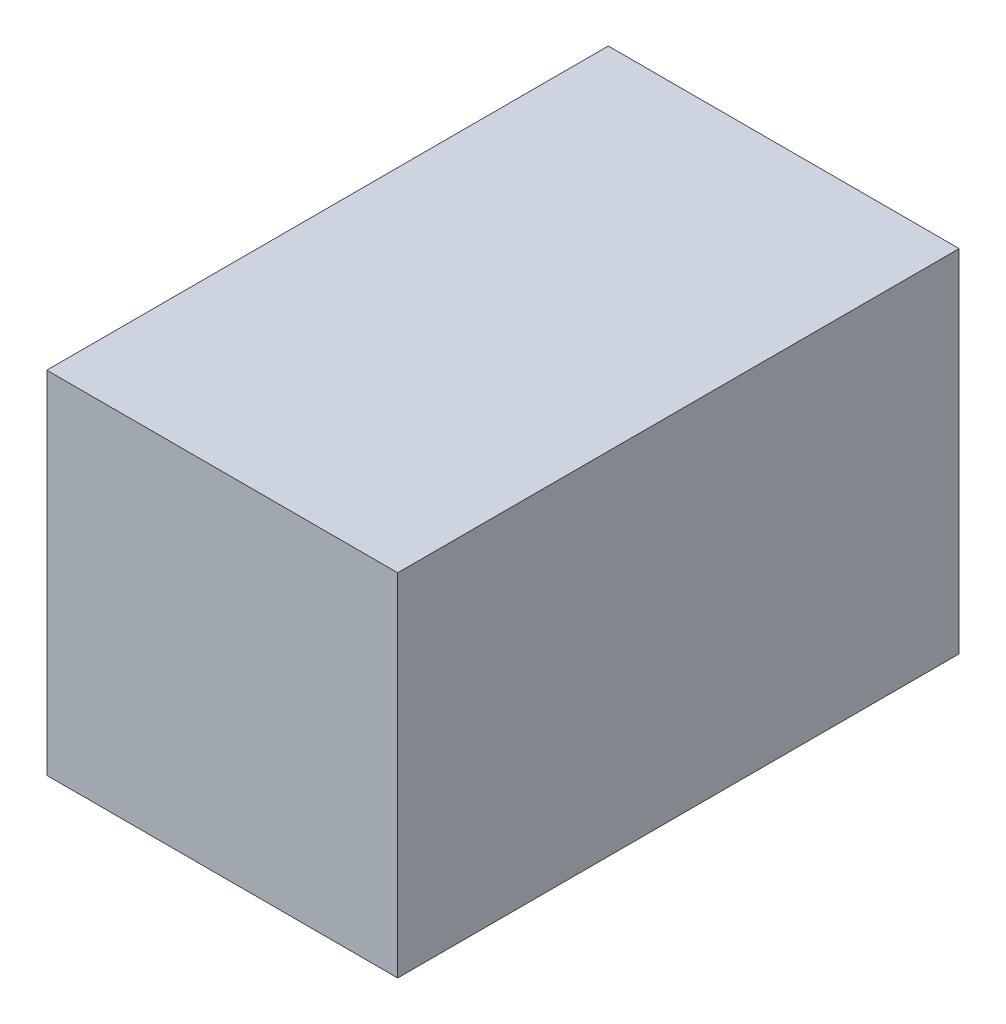
ISO-10303-21;
HEADER;
FILE_DESCRIPTION(('STEP AP214'),'2;1');
FILE_NAME('part.step','',(''),(''),'','','');
FILE_SCHEMA(('AUTOMOTIVE_DESIGN { 1 0 10303 214 1 1 1 1 }'));
ENDSEC;
DATA;
#1=APPLICATION_CONTEXT('core data for automotive mechanical design processes');
#2=APPLICATION_PROTOCOL_DEFINITION('international standard','automotive_design',2000,#1);
#3=PRODUCT_CONTEXT('',#1,'mechanical');
#4=PRODUCT('Part','Part','',(#3));
#5=PRODUCT_RELATED_PRODUCT_CATEGORY('part','',(#4));
#6=PRODUCT_DEFINITION_FORMATION('','',#4);
#7=PRODUCT_DEFINITION_CONTEXT('part definition',#1,'design');
#8=PRODUCT_DEFINITION('design','',#6,#7);
#9=PRODUCT_DEFINITION_SHAPE('','',#8);
#10=(LENGTH_UNIT() NAMED_UNIT(*) SI_UNIT(.MILLI.,.METRE.));
#11=(NAMED_UNIT(*) PLANE_ANGLE_UNIT() SI_UNIT($,.RADIAN.));
#12=(NAMED_UNIT(*) SI_UNIT($,.STERADIAN.) SOLID_ANGLE_UNIT());
#13=UNCERTAINTY_MEASURE_WITH_UNIT(LENGTH_MEASURE(1.E-05),#10,'distance_accuracy_value','');
#14=(GEOMETRIC_REPRESENTATION_CONTEXT(3) GLOBAL_UNCERTAINTY_ASSIGNED_CONTEXT((#13)) GLOBAL_UNIT_ASSIGNED_CONTEXT((#10,
#11,#12)) REPRESENTATION_CONTEXT('',''));
#15=CARTESIAN_POINT('',(0.,0.,0.));
#16=DIRECTION('',(0.,0.,1.));
#17=DIRECTION('',(1.,0.,0.));
#18=AXIS2_PLACEMENT_3D('',#15,#16,#17);
#19=CARTESIAN_POINT('',(762.,-762.,1219.2));
#20=DIRECTION('',(-1.,0.,0.));
#21=DIRECTION('',(0.,0.,1.));
#22=AXIS2_PLACEMENT_3D('',#19,#20,#21);
#23=PLANE('',#22);
#24=DIRECTION('',(0.,1.,0.));
#25=VECTOR('',#24,1.);
#26=CARTESIAN_POINT('',(762.,-762.,-1219.2));
#27=LINE('',#26,#25);
#28=CARTESIAN_POINT('',(762.,-762.,-1219.2));
#29=VERTEX_POINT('',#28);
#30=CARTESIAN_POINT('',(762.,762.,-1219.2));
#31=VERTEX_POINT('',#30);
#32=EDGE_CURVE('E112',#29,#31,#27,.T.);
#33=ORIENTED_EDGE('',*,*,#32,.T.);
#34=DIRECTION('',(0.,0.,-1.));
#35=VECTOR('',#34,1.);
#36=CARTESIAN_POINT('',(762.,762.,1219.2));
#37=LINE('',#36,#35);
#38=CARTESIAN_POINT('',(762.,762.,1219.2));
#39=VERTEX_POINT('',#38);
#40=EDGE_CURVE('E11',#39,#31,#37,.T.);
#41=ORIENTED_EDGE('',*,*,#40,.F.);
#42=DIRECTION('',(0.,1.,0.));
#43=VECTOR('',#42,1.);
#44=CARTESIAN_POINT('',(762.,-762.,1219.2));
#45=LINE('',#44,#43);
#46=CARTESIAN_POINT('',(762.,-762.,1219.2));
#47=VERTEX_POINT('',#46);
#48=EDGE_CURVE('E99',#47,#39,#45,.T.);
#49=ORIENTED_EDGE('',*,*,#48,.F.);
#50=DIRECTION('',(0.,0.,-1.));
#51=VECTOR('',#50,1.);
#52=CARTESIAN_POINT('',(762.,-762.,1219.2));
#53=LINE('',#52,#51);
#54=EDGE_CURVE('E108',#47,#29,#53,.T.);
#55=ORIENTED_EDGE('',*,*,#54,.T.);
#56=EDGE_LOOP('',(#33,#41,#49,#55));
#57=FACE_BOUND('',#56,.T.);
#58=ADVANCED_FACE('F44',(#57),#23,.F.);
#59=CARTESIAN_POINT('',(-762.,762.,1219.2));
#60=DIRECTION('',(0.,-1.,0.));
#61=DIRECTION('',(0.,0.,-1.));
#62=AXIS2_PLACEMENT_3D('',#59,#60,#61);
#63=PLANE('',#62);
#64=DIRECTION('',(-1.,0.,0.));
#65=VECTOR('',#64,1.);
#66=CARTESIAN_POINT('',(-762.,762.,-1219.2));
#67=LINE('',#66,#65);
#68=CARTESIAN_POINT('',(-762.,762.,-1219.2));
#69=VERTEX_POINT('',#68);
#70=EDGE_CURVE('E103',#31,#69,#67,.T.);
#71=ORIENTED_EDGE('',*,*,#70,.T.);
#72=DIRECTION('',(0.,0.,-1.));
#73=VECTOR('',#72,1.);
#74=CARTESIAN_POINT('',(-762.,762.,1219.2));
#75=LINE('',#74,#73);
#76=CARTESIAN_POINT('',(-762.,762.,1219.2));
#77=VERTEX_POINT('',#76);
#78=EDGE_CURVE('E52',#77,#69,#75,.T.);
#79=ORIENTED_EDGE('',*,*,#78,.F.);
#80=DIRECTION('',(-1.,0.,0.));
#81=VECTOR('',#80,1.);
#82=CARTESIAN_POINT('',(-762.,762.,1219.2));
#83=LINE('',#82,#81);
#84=EDGE_CURVE('E93',#39,#77,#83,.T.);
#85=ORIENTED_EDGE('',*,*,#84,.F.);
#86=ORIENTED_EDGE('',*,*,#40,.T.);
#87=EDGE_LOOP('',(#71,#79,#85,#86));
#88=FACE_BOUND('',#87,.T.);
#89=ADVANCED_FACE('F102',(#88),#63,.F.);
#90=CARTESIAN_POINT('',(-762.,-762.,1219.2));
#91=DIRECTION('',(1.,0.,0.));
#92=DIRECTION('',(0.,0.,-1.));
#93=AXIS2_PLACEMENT_3D('',#90,#91,#92);
#94=PLANE('',#93);
#95=DIRECTION('',(0.,-1.,0.));
#96=VECTOR('',#95,1.);
#97=CARTESIAN_POINT('',(-762.,-762.,-1219.2));
#98=LINE('',#97,#96);
#99=CARTESIAN_POINT('',(-762.,-762.,-1219.2));
#100=VERTEX_POINT('',#99);
#101=EDGE_CURVE('E80',#69,#100,#98,.T.);
#102=ORIENTED_EDGE('',*,*,#101,.T.);
#103=DIRECTION('',(0.,0.,-1.));
#104=VECTOR('',#103,1.);
#105=CARTESIAN_POINT('',(-762.,-762.,1219.2));
#106=LINE('',#105,#104);
#107=CARTESIAN_POINT('',(-762.,-762.,1219.2));
#108=VERTEX_POINT('',#107);
#109=EDGE_CURVE('E104',#108,#100,#106,.T.);
#110=ORIENTED_EDGE('',*,*,#109,.F.);
#111=DIRECTION('',(0.,-1.,0.));
#112=VECTOR('',#111,1.);
#113=CARTESIAN_POINT('',(-762.,-762.,1219.2));
#114=LINE('',#113,#112);
#115=EDGE_CURVE('E97',#77,#108,#114,.T.);
#116=ORIENTED_EDGE('',*,*,#115,.F.);
#117=ORIENTED_EDGE('',*,*,#78,.T.);
#118=EDGE_LOOP('',(#102,#110,#116,#117));
#119=FACE_BOUND('',#118,.T.);
#120=ADVANCED_FACE('F106',(#119),#94,.F.);
#121=CARTESIAN_POINT('',(-762.,-762.,1219.2));
#122=DIRECTION('',(0.,1.,0.));
#123=DIRECTION('',(0.,0.,1.));
#124=AXIS2_PLACEMENT_3D('',#121,#122,#123);
#125=PLANE('',#124);
#126=DIRECTION('',(1.,0.,0.));
#127=VECTOR('',#126,1.);
#128=CARTESIAN_POINT('',(-762.,-762.,-1219.2));
#129=LINE('',#128,#127);
#130=EDGE_CURVE('E86',#100,#29,#129,.T.);
#131=ORIENTED_EDGE('',*,*,#130,.T.);
#132=ORIENTED_EDGE('',*,*,#54,.F.);
#133=DIRECTION('',(1.,0.,0.));
#134=VECTOR('',#133,1.);
#135=CARTESIAN_POINT('',(-762.,-762.,1219.2));
#136=LINE('',#135,#134);
#137=EDGE_CURVE('E60',#108,#47,#136,.T.);
#138=ORIENTED_EDGE('',*,*,#137,.F.);
#139=ORIENTED_EDGE('',*,*,#109,.T.);
#140=EDGE_LOOP('',(#131,#132,#138,#139));
#141=FACE_BOUND('',#140,.T.);
#142=ADVANCED_FACE('F119',(#141),#125,.F.);
#143=CARTESIAN_POINT('',(0.,0.,1219.2));
#144=DIRECTION('',(0.,0.,-1.));
#145=DIRECTION('',(-1.,0.,0.));
#146=AXIS2_PLACEMENT_3D('',#143,#144,#145);
#147=PLANE('',#146);
#148=ORIENTED_EDGE('',*,*,#48,.T.);
#149=ORIENTED_EDGE('',*,*,#84,.T.);
#150=ORIENTED_EDGE('',*,*,#115,.T.);
#151=ORIENTED_EDGE('',*,*,#137,.T.);
#152=EDGE_LOOP('',(#148,#149,#150,#151));
#153=FACE_BOUND('',#152,.T.);
#154=ADVANCED_FACE('F95',(#153),#147,.F.);
#155=CARTESIAN_POINT('',(0.,0.,-1219.2));
#156=DIRECTION('',(0.,0.,-1.));
#157=DIRECTION('',(-1.,0.,0.));
#158=AXIS2_PLACEMENT_3D('',#155,#156,#157);
#159=PLANE('',#158);
#160=ORIENTED_EDGE('',*,*,#32,.F.);
#161=ORIENTED_EDGE('',*,*,#130,.F.);
#162=ORIENTED_EDGE('',*,*,#101,.F.);
#163=ORIENTED_EDGE('',*,*,#70,.F.);
#164=EDGE_LOOP('',(#160,#161,#162,#163));
#165=FACE_BOUND('',#164,.T.);
#166=ADVANCED_FACE('F122',(#165),#159,.T.);
#167=CLOSED_SHELL('',(#58,#89,#120,#142,#154,#166));
#168=MANIFOLD_SOLID_BREP('B2',#167);
#169=ADVANCED_BREP_SHAPE_REPRESENTATION('',(#18,#168),#14);
#170=SHAPE_DEFINITION_REPRESENTATION(#9,#169);
ENDSEC;
END-ISO-10303-21;
